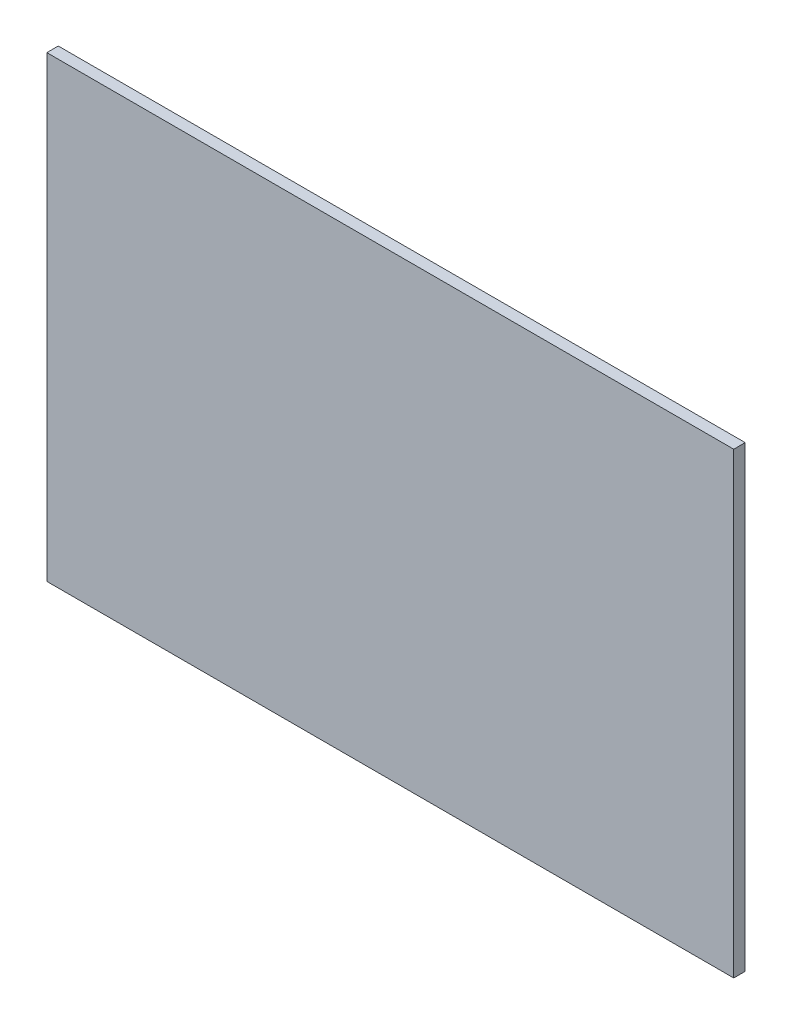
ISO-10303-21;
HEADER;
FILE_DESCRIPTION(('STEP AP214'),'2;1');
FILE_NAME('part.step','',(''),(''),'','','');
FILE_SCHEMA(('AUTOMOTIVE_DESIGN { 1 0 10303 214 1 1 1 1 }'));
ENDSEC;
DATA;
#1=APPLICATION_CONTEXT('core data for automotive mechanical design processes');
#2=APPLICATION_PROTOCOL_DEFINITION('international standard','automotive_design',2000,#1);
#3=PRODUCT_CONTEXT('',#1,'mechanical');
#4=PRODUCT('Part','Part','',(#3));
#5=PRODUCT_RELATED_PRODUCT_CATEGORY('part','',(#4));
#6=PRODUCT_DEFINITION_FORMATION('','',#4);
#7=PRODUCT_DEFINITION_CONTEXT('part definition',#1,'design');
#8=PRODUCT_DEFINITION('design','',#6,#7);
#9=PRODUCT_DEFINITION_SHAPE('','',#8);
#10=(LENGTH_UNIT() NAMED_UNIT(*) SI_UNIT(.MILLI.,.METRE.));
#11=(NAMED_UNIT(*) PLANE_ANGLE_UNIT() SI_UNIT($,.RADIAN.));
#12=(NAMED_UNIT(*) SI_UNIT($,.STERADIAN.) SOLID_ANGLE_UNIT());
#13=UNCERTAINTY_MEASURE_WITH_UNIT(LENGTH_MEASURE(1.E-05),#10,'distance_accuracy_value','');
#14=(GEOMETRIC_REPRESENTATION_CONTEXT(3) GLOBAL_UNCERTAINTY_ASSIGNED_CONTEXT((#13)) GLOBAL_UNIT_ASSIGNED_CONTEXT((#10,
#11,#12)) REPRESENTATION_CONTEXT('',''));
#15=CARTESIAN_POINT('',(0.,0.,0.));
#16=DIRECTION('',(0.,0.,1.));
#17=DIRECTION('',(1.,0.,0.));
#18=AXIS2_PLACEMENT_3D('',#15,#16,#17);
#19=CARTESIAN_POINT('',(-300.,-200.,10.));
#20=DIRECTION('',(1.,0.,0.));
#21=DIRECTION('',(0.,0.,-1.));
#22=AXIS2_PLACEMENT_3D('',#19,#20,#21);
#23=PLANE('',#22);
#24=DIRECTION('',(0.,-1.,0.));
#25=VECTOR('',#24,1.);
#26=CARTESIAN_POINT('',(-300.,-200.,0.));
#27=LINE('',#26,#25);
#28=CARTESIAN_POINT('',(-300.,200.,0.));
#29=VERTEX_POINT('',#28);
#30=CARTESIAN_POINT('',(-300.,-200.,0.));
#31=VERTEX_POINT('',#30);
#32=EDGE_CURVE('E101',#29,#31,#27,.T.);
#33=ORIENTED_EDGE('',*,*,#32,.T.);
#34=DIRECTION('',(0.,0.,-1.));
#35=VECTOR('',#34,1.);
#36=CARTESIAN_POINT('',(-300.,-200.,10.));
#37=LINE('',#36,#35);
#38=CARTESIAN_POINT('',(-300.,-200.,10.));
#39=VERTEX_POINT('',#38);
#40=EDGE_CURVE('E11',#39,#31,#37,.T.);
#41=ORIENTED_EDGE('',*,*,#40,.F.);
#42=DIRECTION('',(0.,-1.,0.));
#43=VECTOR('',#42,1.);
#44=CARTESIAN_POINT('',(-300.,-200.,10.));
#45=LINE('',#44,#43);
#46=CARTESIAN_POINT('',(-300.,200.,10.));
#47=VERTEX_POINT('',#46);
#48=EDGE_CURVE('E89',#47,#39,#45,.T.);
#49=ORIENTED_EDGE('',*,*,#48,.F.);
#50=DIRECTION('',(0.,0.,-1.));
#51=VECTOR('',#50,1.);
#52=CARTESIAN_POINT('',(-300.,200.,10.));
#53=LINE('',#52,#51);
#54=EDGE_CURVE('E97',#47,#29,#53,.T.);
#55=ORIENTED_EDGE('',*,*,#54,.T.);
#56=EDGE_LOOP('',(#33,#41,#49,#55));
#57=FACE_BOUND('',#56,.T.);
#58=ADVANCED_FACE('F38',(#57),#23,.F.);
#59=CARTESIAN_POINT('',(300.,-200.,10.));
#60=DIRECTION('',(0.,1.,0.));
#61=DIRECTION('',(-1.,0.,0.));
#62=AXIS2_PLACEMENT_3D('',#59,#60,#61);
#63=PLANE('',#62);
#64=DIRECTION('',(1.,0.,0.));
#65=VECTOR('',#64,1.);
#66=CARTESIAN_POINT('',(300.,-200.,0.));
#67=LINE('',#66,#65);
#68=CARTESIAN_POINT('',(300.,-200.,0.));
#69=VERTEX_POINT('',#68);
#70=EDGE_CURVE('E93',#31,#69,#67,.T.);
#71=ORIENTED_EDGE('',*,*,#70,.T.);
#72=DIRECTION('',(0.,0.,-1.));
#73=VECTOR('',#72,1.);
#74=CARTESIAN_POINT('',(300.,-200.,10.));
#75=LINE('',#74,#73);
#76=CARTESIAN_POINT('',(300.,-200.,10.));
#77=VERTEX_POINT('',#76);
#78=EDGE_CURVE('E46',#77,#69,#75,.T.);
#79=ORIENTED_EDGE('',*,*,#78,.F.);
#80=DIRECTION('',(1.,0.,0.));
#81=VECTOR('',#80,1.);
#82=CARTESIAN_POINT('',(300.,-200.,10.));
#83=LINE('',#82,#81);
#84=EDGE_CURVE('E84',#39,#77,#83,.T.);
#85=ORIENTED_EDGE('',*,*,#84,.F.);
#86=ORIENTED_EDGE('',*,*,#40,.T.);
#87=EDGE_LOOP('',(#71,#79,#85,#86));
#88=FACE_BOUND('',#87,.T.);
#89=ADVANCED_FACE('F92',(#88),#63,.F.);
#90=CARTESIAN_POINT('',(300.,-200.,10.));
#91=DIRECTION('',(-1.,0.,0.));
#92=DIRECTION('',(0.,0.,1.));
#93=AXIS2_PLACEMENT_3D('',#90,#91,#92);
#94=PLANE('',#93);
#95=DIRECTION('',(0.,1.,0.));
#96=VECTOR('',#95,1.);
#97=CARTESIAN_POINT('',(300.,-200.,0.));
#98=LINE('',#97,#96);
#99=CARTESIAN_POINT('',(300.,200.,0.));
#100=VERTEX_POINT('',#99);
#101=EDGE_CURVE('E71',#69,#100,#98,.T.);
#102=ORIENTED_EDGE('',*,*,#101,.T.);
#103=DIRECTION('',(0.,0.,-1.));
#104=VECTOR('',#103,1.);
#105=CARTESIAN_POINT('',(300.,200.,10.));
#106=LINE('',#105,#104);
#107=CARTESIAN_POINT('',(300.,200.,10.));
#108=VERTEX_POINT('',#107);
#109=EDGE_CURVE('E94',#108,#100,#106,.T.);
#110=ORIENTED_EDGE('',*,*,#109,.F.);
#111=DIRECTION('',(0.,1.,0.));
#112=VECTOR('',#111,1.);
#113=CARTESIAN_POINT('',(300.,-200.,10.));
#114=LINE('',#113,#112);
#115=EDGE_CURVE('E87',#77,#108,#114,.T.);
#116=ORIENTED_EDGE('',*,*,#115,.F.);
#117=ORIENTED_EDGE('',*,*,#78,.T.);
#118=EDGE_LOOP('',(#102,#110,#116,#117));
#119=FACE_BOUND('',#118,.T.);
#120=ADVANCED_FACE('F95',(#119),#94,.F.);
#121=CARTESIAN_POINT('',(300.,200.,10.));
#122=DIRECTION('',(0.,-1.,0.));
#123=DIRECTION('',(1.,0.,0.));
#124=AXIS2_PLACEMENT_3D('',#121,#122,#123);
#125=PLANE('',#124);
#126=DIRECTION('',(-1.,0.,0.));
#127=VECTOR('',#126,1.);
#128=CARTESIAN_POINT('',(300.,200.,0.));
#129=LINE('',#128,#127);
#130=EDGE_CURVE('E77',#100,#29,#129,.T.);
#131=ORIENTED_EDGE('',*,*,#130,.T.);
#132=ORIENTED_EDGE('',*,*,#54,.F.);
#133=DIRECTION('',(-1.,0.,0.));
#134=VECTOR('',#133,1.);
#135=CARTESIAN_POINT('',(300.,200.,10.));
#136=LINE('',#135,#134);
#137=EDGE_CURVE('E54',#108,#47,#136,.T.);
#138=ORIENTED_EDGE('',*,*,#137,.F.);
#139=ORIENTED_EDGE('',*,*,#109,.T.);
#140=EDGE_LOOP('',(#131,#132,#138,#139));
#141=FACE_BOUND('',#140,.T.);
#142=ADVANCED_FACE('F108',(#141),#125,.F.);
#143=CARTESIAN_POINT('',(0.,0.,10.));
#144=DIRECTION('',(0.,0.,1.));
#145=DIRECTION('',(1.,0.,0.));
#146=AXIS2_PLACEMENT_3D('',#143,#144,#145);
#147=PLANE('',#146);
#148=ORIENTED_EDGE('',*,*,#48,.T.);
#149=ORIENTED_EDGE('',*,*,#84,.T.);
#150=ORIENTED_EDGE('',*,*,#115,.T.);
#151=ORIENTED_EDGE('',*,*,#137,.T.);
#152=EDGE_LOOP('',(#148,#149,#150,#151));
#153=FACE_BOUND('',#152,.T.);
#154=ADVANCED_FACE('F85',(#153),#147,.T.);
#155=CARTESIAN_POINT('',(0.,0.,0.));
#156=DIRECTION('',(0.,0.,1.));
#157=DIRECTION('',(1.,0.,0.));
#158=AXIS2_PLACEMENT_3D('',#155,#156,#157);
#159=PLANE('',#158);
#160=ORIENTED_EDGE('',*,*,#32,.F.);
#161=ORIENTED_EDGE('',*,*,#130,.F.);
#162=ORIENTED_EDGE('',*,*,#101,.F.);
#163=ORIENTED_EDGE('',*,*,#70,.F.);
#164=EDGE_LOOP('',(#160,#161,#162,#163));
#165=FACE_BOUND('',#164,.T.);
#166=ADVANCED_FACE('F111',(#165),#159,.F.);
#167=CLOSED_SHELL('',(#58,#89,#120,#142,#154,#166));
#168=MANIFOLD_SOLID_BREP('B2',#167);
#169=ADVANCED_BREP_SHAPE_REPRESENTATION('',(#18,#168),#14);
#170=SHAPE_DEFINITION_REPRESENTATION(#9,#169);
ENDSEC;
END-ISO-10303-21;
